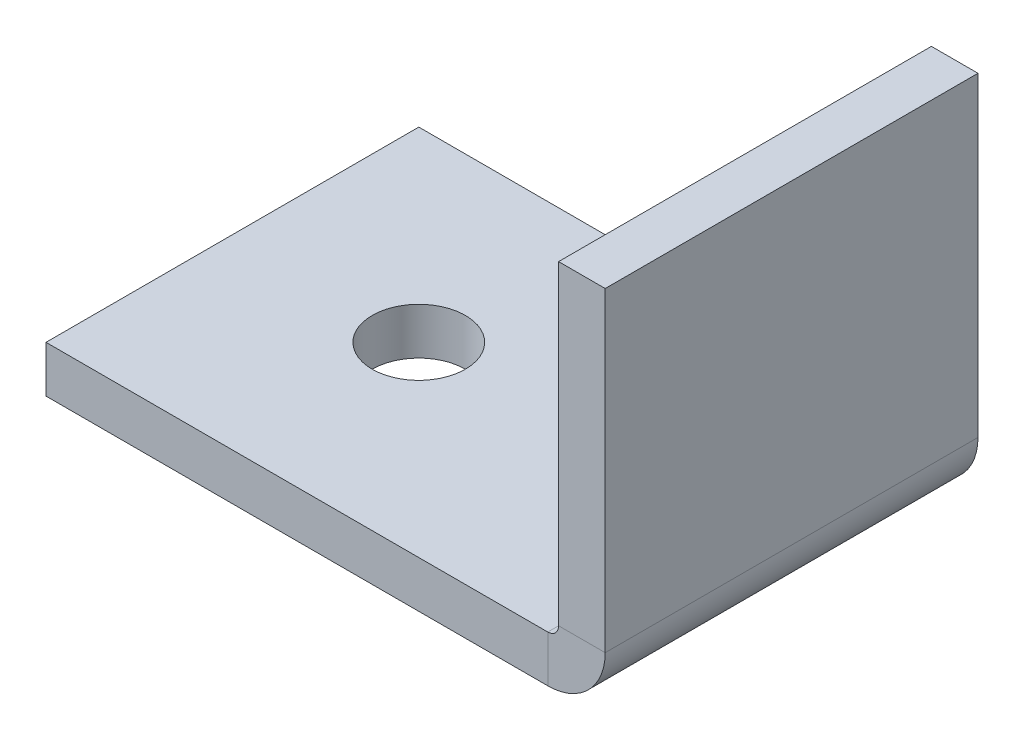
ISO-10303-21;
HEADER;
FILE_DESCRIPTION(('STEP AP214'),'2;1');
FILE_NAME('part.step','',(''),(''),'','','');
FILE_SCHEMA(('AUTOMOTIVE_DESIGN { 1 0 10303 214 1 1 1 1 }'));
ENDSEC;
DATA;
#1=APPLICATION_CONTEXT('core data for automotive mechanical design processes');
#2=APPLICATION_PROTOCOL_DEFINITION('international standard','automotive_design',2000,#1);
#3=PRODUCT_CONTEXT('',#1,'mechanical');
#4=PRODUCT('Part','Part','',(#3));
#5=PRODUCT_RELATED_PRODUCT_CATEGORY('part','',(#4));
#6=PRODUCT_DEFINITION_FORMATION('','',#4);
#7=PRODUCT_DEFINITION_CONTEXT('part definition',#1,'design');
#8=PRODUCT_DEFINITION('design','',#6,#7);
#9=PRODUCT_DEFINITION_SHAPE('','',#8);
#10=(LENGTH_UNIT() NAMED_UNIT(*) SI_UNIT(.MILLI.,.METRE.));
#11=(NAMED_UNIT(*) PLANE_ANGLE_UNIT() SI_UNIT($,.RADIAN.));
#12=(NAMED_UNIT(*) SI_UNIT($,.STERADIAN.) SOLID_ANGLE_UNIT());
#13=UNCERTAINTY_MEASURE_WITH_UNIT(LENGTH_MEASURE(1.E-05),#10,'distance_accuracy_value','');
#14=(GEOMETRIC_REPRESENTATION_CONTEXT(3) GLOBAL_UNCERTAINTY_ASSIGNED_CONTEXT((#13)) GLOBAL_UNIT_ASSIGNED_CONTEXT((#10,
#11,#12)) REPRESENTATION_CONTEXT('',''));
#15=CARTESIAN_POINT('',(0.,0.,0.));
#16=DIRECTION('',(0.,0.,1.));
#17=DIRECTION('',(1.,0.,0.));
#18=AXIS2_PLACEMENT_3D('',#15,#16,#17);
#19=CARTESIAN_POINT('',(-19.05,-3.175,-12.7));
#20=DIRECTION('',(0.,0.,-1.));
#21=DIRECTION('',(-1.,0.,0.));
#22=AXIS2_PLACEMENT_3D('',#19,#20,#21);
#23=PLANE('',#22);
#24=DIRECTION('',(-1.,0.,0.));
#25=VECTOR('',#24,1.);
#26=CARTESIAN_POINT('',(-19.05,0.,-12.7));
#27=LINE('',#26,#25);
#28=CARTESIAN_POINT('',(15.1384,0.,-12.7));
#29=VERTEX_POINT('',#28);
#30=CARTESIAN_POINT('',(-19.05,0.,-12.7));
#31=VERTEX_POINT('',#30);
#32=EDGE_CURVE('E113',#29,#31,#27,.T.);
#33=ORIENTED_EDGE('',*,*,#32,.F.);
#34=DIRECTION('',(0.,-1.,0.));
#35=VECTOR('',#34,1.);
#36=CARTESIAN_POINT('',(15.1384,0.,-12.7));
#37=LINE('',#36,#35);
#38=CARTESIAN_POINT('',(15.1384,-3.175,-12.7));
#39=VERTEX_POINT('',#38);
#40=EDGE_CURVE('E126',#29,#39,#37,.T.);
#41=ORIENTED_EDGE('',*,*,#40,.T.);
#42=DIRECTION('',(-1.,0.,0.));
#43=VECTOR('',#42,1.);
#44=CARTESIAN_POINT('',(-19.05,-3.175,-12.7));
#45=LINE('',#44,#43);
#46=CARTESIAN_POINT('',(-19.05,-3.175,-12.7));
#47=VERTEX_POINT('',#46);
#48=EDGE_CURVE('E118',#39,#47,#45,.T.);
#49=ORIENTED_EDGE('',*,*,#48,.T.);
#50=DIRECTION('',(0.,1.,0.));
#51=VECTOR('',#50,1.);
#52=CARTESIAN_POINT('',(-19.05,-3.175,-12.7));
#53=LINE('',#52,#51);
#54=EDGE_CURVE('E68',#47,#31,#53,.T.);
#55=ORIENTED_EDGE('',*,*,#54,.T.);
#56=EDGE_LOOP('',(#33,#41,#49,#55));
#57=FACE_BOUND('',#56,.T.);
#58=ADVANCED_FACE('F65',(#57),#23,.T.);
#59=CARTESIAN_POINT('',(0.,-3.175,0.));
#60=DIRECTION('',(0.,-1.,0.));
#61=DIRECTION('',(0.,0.,-1.));
#62=AXIS2_PLACEMENT_3D('',#59,#60,#61);
#63=PLANE('',#62);
#64=CARTESIAN_POINT('',(-6.34999999999992,-3.175,0.));
#65=DIRECTION('',(0.,1.,0.));
#66=DIRECTION('',(0.,0.,1.));
#67=AXIS2_PLACEMENT_3D('',#64,#65,#66);
#68=CIRCLE('',#67,3.175);
#69=CARTESIAN_POINT('',(-6.34999999999992,-3.175,3.175));
#70=VERTEX_POINT('',#69);
#71=EDGE_CURVE('E151',#70,#70,#68,.T.);
#72=ORIENTED_EDGE('',*,*,#71,.T.);
#73=EDGE_LOOP('',(#72));
#74=FACE_BOUND('',#73,.T.);
#75=ORIENTED_EDGE('',*,*,#48,.F.);
#76=DIRECTION('',(0.,0.,-1.));
#77=VECTOR('',#76,1.);
#78=CARTESIAN_POINT('',(15.1384,-3.175,-12.7));
#79=LINE('',#78,#77);
#80=CARTESIAN_POINT('',(15.1384,-3.175,12.7));
#81=VERTEX_POINT('',#80);
#82=EDGE_CURVE('E143',#39,#81,#79,.F.);
#83=ORIENTED_EDGE('',*,*,#82,.T.);
#84=DIRECTION('',(1.,0.,0.));
#85=VECTOR('',#84,1.);
#86=CARTESIAN_POINT('',(-19.05,-3.175,12.7));
#87=LINE('',#86,#85);
#88=CARTESIAN_POINT('',(-19.05,-3.175,12.7));
#89=VERTEX_POINT('',#88);
#90=EDGE_CURVE('E123',#89,#81,#87,.T.);
#91=ORIENTED_EDGE('',*,*,#90,.F.);
#92=DIRECTION('',(0.,0.,1.));
#93=VECTOR('',#92,1.);
#94=CARTESIAN_POINT('',(-19.05,-3.175,12.7));
#95=LINE('',#94,#93);
#96=EDGE_CURVE('E103',#47,#89,#95,.T.);
#97=ORIENTED_EDGE('',*,*,#96,.F.);
#98=EDGE_LOOP('',(#75,#83,#91,#97));
#99=FACE_BOUND('',#98,.T.);
#100=ADVANCED_FACE('F188',(#74,#99),#63,.T.);
#101=CARTESIAN_POINT('',(0.,0.,0.));
#102=DIRECTION('',(0.,-1.,0.));
#103=DIRECTION('',(0.,0.,-1.));
#104=AXIS2_PLACEMENT_3D('',#101,#102,#103);
#105=PLANE('',#104);
#106=CARTESIAN_POINT('',(-6.34999999999992,0.,0.));
#107=DIRECTION('',(0.,1.,0.));
#108=DIRECTION('',(0.,0.,1.));
#109=AXIS2_PLACEMENT_3D('',#106,#107,#108);
#110=CIRCLE('',#109,3.175);
#111=CARTESIAN_POINT('',(-6.34999999999992,0.,3.175));
#112=VERTEX_POINT('',#111);
#113=EDGE_CURVE('E182',#112,#112,#110,.T.);
#114=ORIENTED_EDGE('',*,*,#113,.F.);
#115=EDGE_LOOP('',(#114));
#116=FACE_BOUND('',#115,.T.);
#117=DIRECTION('',(0.,0.,-1.));
#118=VECTOR('',#117,1.);
#119=CARTESIAN_POINT('',(15.1384,0.,-12.7));
#120=LINE('',#119,#118);
#121=CARTESIAN_POINT('',(15.1384,0.,12.7));
#122=VERTEX_POINT('',#121);
#123=EDGE_CURVE('E133',#29,#122,#120,.F.);
#124=ORIENTED_EDGE('',*,*,#123,.F.);
#125=ORIENTED_EDGE('',*,*,#32,.T.);
#126=DIRECTION('',(0.,0.,1.));
#127=VECTOR('',#126,1.);
#128=CARTESIAN_POINT('',(-19.05,0.,12.7));
#129=LINE('',#128,#127);
#130=CARTESIAN_POINT('',(-19.05,0.,12.7));
#131=VERTEX_POINT('',#130);
#132=EDGE_CURVE('E101',#31,#131,#129,.T.);
#133=ORIENTED_EDGE('',*,*,#132,.T.);
#134=DIRECTION('',(1.,0.,0.));
#135=VECTOR('',#134,1.);
#136=CARTESIAN_POINT('',(-19.05,0.,12.7));
#137=LINE('',#136,#135);
#138=EDGE_CURVE('E110',#131,#122,#137,.T.);
#139=ORIENTED_EDGE('',*,*,#138,.T.);
#140=EDGE_LOOP('',(#124,#125,#133,#139));
#141=FACE_BOUND('',#140,.T.);
#142=ADVANCED_FACE('F108',(#116,#141),#105,.F.);
#143=CARTESIAN_POINT('',(-19.05,-3.175,12.7));
#144=DIRECTION('',(0.,0.,1.));
#145=DIRECTION('',(1.,0.,0.));
#146=AXIS2_PLACEMENT_3D('',#143,#144,#145);
#147=PLANE('',#146);
#148=DIRECTION('',(0.,-1.,0.));
#149=VECTOR('',#148,1.);
#150=CARTESIAN_POINT('',(15.1384,0.,12.7));
#151=LINE('',#150,#149);
#152=EDGE_CURVE('E117',#122,#81,#151,.T.);
#153=ORIENTED_EDGE('',*,*,#152,.F.);
#154=ORIENTED_EDGE('',*,*,#138,.F.);
#155=DIRECTION('',(0.,1.,0.));
#156=VECTOR('',#155,1.);
#157=CARTESIAN_POINT('',(-19.05,-3.175,12.7));
#158=LINE('',#157,#156);
#159=EDGE_CURVE('E13',#89,#131,#158,.T.);
#160=ORIENTED_EDGE('',*,*,#159,.F.);
#161=ORIENTED_EDGE('',*,*,#90,.T.);
#162=EDGE_LOOP('',(#153,#154,#160,#161));
#163=FACE_BOUND('',#162,.T.);
#164=ADVANCED_FACE('F116',(#163),#147,.T.);
#165=CARTESIAN_POINT('',(-19.05,-3.175,12.7));
#166=DIRECTION('',(-1.,0.,0.));
#167=DIRECTION('',(0.,0.,1.));
#168=AXIS2_PLACEMENT_3D('',#165,#166,#167);
#169=PLANE('',#168);
#170=ORIENTED_EDGE('',*,*,#132,.F.);
#171=ORIENTED_EDGE('',*,*,#54,.F.);
#172=ORIENTED_EDGE('',*,*,#96,.T.);
#173=ORIENTED_EDGE('',*,*,#159,.T.);
#174=EDGE_LOOP('',(#170,#171,#172,#173));
#175=FACE_BOUND('',#174,.T.);
#176=ADVANCED_FACE('F99',(#175),#169,.T.);
#177=CARTESIAN_POINT('',(15.1384,0.736599999999999,12.7));
#178=DIRECTION('',(0.,0.,1.));
#179=DIRECTION('',(1.,0.,0.));
#180=AXIS2_PLACEMENT_3D('',#177,#178,#179);
#181=PLANE('',#180);
#182=DIRECTION('',(-1.,0.,0.));
#183=VECTOR('',#182,1.);
#184=CARTESIAN_POINT('',(19.05,0.736599999999986,12.7));
#185=LINE('',#184,#183);
#186=CARTESIAN_POINT('',(15.875,0.736599999999997,12.7));
#187=VERTEX_POINT('',#186);
#188=CARTESIAN_POINT('',(19.05,0.736599999999986,12.7));
#189=VERTEX_POINT('',#188);
#190=EDGE_CURVE('E147',#187,#189,#185,.F.);
#191=ORIENTED_EDGE('',*,*,#190,.F.);
#192=CARTESIAN_POINT('',(15.1384,0.736599999999999,12.7));
#193=DIRECTION('',(0.,0.,-1.));
#194=DIRECTION('',(-1.,0.,0.));
#195=AXIS2_PLACEMENT_3D('',#192,#193,#194);
#196=CIRCLE('',#195,0.7366);
#197=EDGE_CURVE('E137',#122,#187,#196,.F.);
#198=ORIENTED_EDGE('',*,*,#197,.F.);
#199=ORIENTED_EDGE('',*,*,#152,.T.);
#200=CARTESIAN_POINT('',(15.1384,0.736599999999999,12.7));
#201=DIRECTION('',(0.,0.,-1.));
#202=DIRECTION('',(-1.,0.,0.));
#203=AXIS2_PLACEMENT_3D('',#200,#201,#202);
#204=CIRCLE('',#203,3.9116);
#205=EDGE_CURVE('E79',#81,#189,#204,.F.);
#206=ORIENTED_EDGE('',*,*,#205,.T.);
#207=EDGE_LOOP('',(#191,#198,#199,#206));
#208=FACE_BOUND('',#207,.T.);
#209=ADVANCED_FACE('F262',(#208),#181,.T.);
#210=CARTESIAN_POINT('',(15.1384,0.736599999999999,-12.7));
#211=DIRECTION('',(0.,0.,1.));
#212=DIRECTION('',(1.,0.,0.));
#213=AXIS2_PLACEMENT_3D('',#210,#211,#212);
#214=PLANE('',#213);
#215=CARTESIAN_POINT('',(15.1384,0.736599999999999,-12.7));
#216=DIRECTION('',(0.,0.,-1.));
#217=DIRECTION('',(-1.,0.,0.));
#218=AXIS2_PLACEMENT_3D('',#215,#216,#217);
#219=CIRCLE('',#218,0.7366);
#220=CARTESIAN_POINT('',(15.875,0.736599999999997,-12.7));
#221=VERTEX_POINT('',#220);
#222=EDGE_CURVE('E130',#221,#29,#219,.T.);
#223=ORIENTED_EDGE('',*,*,#222,.F.);
#224=DIRECTION('',(-1.,0.,0.));
#225=VECTOR('',#224,1.);
#226=CARTESIAN_POINT('',(15.875,0.736599999999997,-12.7));
#227=LINE('',#226,#225);
#228=CARTESIAN_POINT('',(19.05,0.736599999999986,-12.7));
#229=VERTEX_POINT('',#228);
#230=EDGE_CURVE('E154',#221,#229,#227,.F.);
#231=ORIENTED_EDGE('',*,*,#230,.T.);
#232=CARTESIAN_POINT('',(15.1384,0.736599999999999,-12.7));
#233=DIRECTION('',(0.,0.,-1.));
#234=DIRECTION('',(-1.,0.,0.));
#235=AXIS2_PLACEMENT_3D('',#232,#233,#234);
#236=CIRCLE('',#235,3.9116);
#237=EDGE_CURVE('E140',#229,#39,#236,.T.);
#238=ORIENTED_EDGE('',*,*,#237,.T.);
#239=ORIENTED_EDGE('',*,*,#40,.F.);
#240=EDGE_LOOP('',(#223,#231,#238,#239));
#241=FACE_BOUND('',#240,.T.);
#242=ADVANCED_FACE('F242',(#241),#214,.F.);
#243=CARTESIAN_POINT('',(15.1384,0.736599999999999,-12.7));
#244=DIRECTION('',(0.,0.,-1.));
#245=DIRECTION('',(1.,0.,0.));
#246=AXIS2_PLACEMENT_3D('',#243,#244,#245);
#247=CYLINDRICAL_SURFACE('',#246,3.9116);
#248=ORIENTED_EDGE('',*,*,#82,.F.);
#249=ORIENTED_EDGE('',*,*,#237,.F.);
#250=DIRECTION('',(0.,0.,-1.));
#251=VECTOR('',#250,1.);
#252=CARTESIAN_POINT('',(19.05,0.736599999999986,12.7));
#253=LINE('',#252,#251);
#254=EDGE_CURVE('E157',#229,#189,#253,.F.);
#255=ORIENTED_EDGE('',*,*,#254,.T.);
#256=ORIENTED_EDGE('',*,*,#205,.F.);
#257=EDGE_LOOP('',(#248,#249,#255,#256));
#258=FACE_BOUND('',#257,.T.);
#259=ADVANCED_FACE('F241',(#258),#247,.T.);
#260=CARTESIAN_POINT('',(15.1384,0.736599999999999,-12.7));
#261=DIRECTION('',(0.,0.,-1.));
#262=DIRECTION('',(1.,0.,0.));
#263=AXIS2_PLACEMENT_3D('',#260,#261,#262);
#264=CYLINDRICAL_SURFACE('',#263,0.7366);
#265=ORIENTED_EDGE('',*,*,#123,.T.);
#266=ORIENTED_EDGE('',*,*,#197,.T.);
#267=DIRECTION('',(0.,0.,-1.));
#268=VECTOR('',#267,1.);
#269=CARTESIAN_POINT('',(15.875,0.736599999999997,12.7));
#270=LINE('',#269,#268);
#271=EDGE_CURVE('E150',#187,#221,#270,.T.);
#272=ORIENTED_EDGE('',*,*,#271,.T.);
#273=ORIENTED_EDGE('',*,*,#222,.T.);
#274=EDGE_LOOP('',(#265,#266,#272,#273));
#275=FACE_BOUND('',#274,.T.);
#276=ADVANCED_FACE('F261',(#275),#264,.F.);
#277=CARTESIAN_POINT('',(19.0500000000001,22.225,-12.7));
#278=DIRECTION('',(0.,0.,1.));
#279=DIRECTION('',(1.,0.,0.));
#280=AXIS2_PLACEMENT_3D('',#277,#278,#279);
#281=PLANE('',#280);
#282=ORIENTED_EDGE('',*,*,#230,.F.);
#283=DIRECTION('',(0.,-1.,0.));
#284=VECTOR('',#283,1.);
#285=CARTESIAN_POINT('',(15.8750000000001,22.225,-12.7));
#286=LINE('',#285,#284);
#287=CARTESIAN_POINT('',(15.8750000000001,22.225,-12.7));
#288=VERTEX_POINT('',#287);
#289=EDGE_CURVE('E159',#221,#288,#286,.F.);
#290=ORIENTED_EDGE('',*,*,#289,.T.);
#291=DIRECTION('',(-1.,0.,0.));
#292=VECTOR('',#291,1.);
#293=CARTESIAN_POINT('',(19.0500000000001,22.225,-12.7));
#294=LINE('',#293,#292);
#295=CARTESIAN_POINT('',(19.0500000000001,22.225,-12.7));
#296=VERTEX_POINT('',#295);
#297=EDGE_CURVE('E134',#296,#288,#294,.T.);
#298=ORIENTED_EDGE('',*,*,#297,.F.);
#299=DIRECTION('',(0.,1.,0.));
#300=VECTOR('',#299,1.);
#301=CARTESIAN_POINT('',(19.05,0.,-12.7));
#302=LINE('',#301,#300);
#303=EDGE_CURVE('E168',#229,#296,#302,.T.);
#304=ORIENTED_EDGE('',*,*,#303,.F.);
#305=EDGE_LOOP('',(#282,#290,#298,#304));
#306=FACE_BOUND('',#305,.T.);
#307=ADVANCED_FACE('F251',(#306),#281,.F.);
#308=CARTESIAN_POINT('',(19.05,0.,12.7));
#309=DIRECTION('',(0.,0.,-1.));
#310=DIRECTION('',(-1.,0.,0.));
#311=AXIS2_PLACEMENT_3D('',#308,#309,#310);
#312=PLANE('',#311);
#313=ORIENTED_EDGE('',*,*,#190,.T.);
#314=DIRECTION('',(0.,-1.,0.));
#315=VECTOR('',#314,1.);
#316=CARTESIAN_POINT('',(19.05,0.,12.7));
#317=LINE('',#316,#315);
#318=CARTESIAN_POINT('',(19.0500000000001,22.225,12.7));
#319=VERTEX_POINT('',#318);
#320=EDGE_CURVE('E174',#319,#189,#317,.T.);
#321=ORIENTED_EDGE('',*,*,#320,.F.);
#322=DIRECTION('',(-1.,0.,0.));
#323=VECTOR('',#322,1.);
#324=CARTESIAN_POINT('',(19.0500000000001,22.225,12.7));
#325=LINE('',#324,#323);
#326=CARTESIAN_POINT('',(15.8750000000001,22.225,12.7));
#327=VERTEX_POINT('',#326);
#328=EDGE_CURVE('E177',#319,#327,#325,.T.);
#329=ORIENTED_EDGE('',*,*,#328,.T.);
#330=DIRECTION('',(0.,1.,0.));
#331=VECTOR('',#330,1.);
#332=CARTESIAN_POINT('',(15.875,0.,12.7));
#333=LINE('',#332,#331);
#334=EDGE_CURVE('E165',#327,#187,#333,.F.);
#335=ORIENTED_EDGE('',*,*,#334,.T.);
#336=EDGE_LOOP('',(#313,#321,#329,#335));
#337=FACE_BOUND('',#336,.T.);
#338=ADVANCED_FACE('F256',(#337),#312,.F.);
#339=CARTESIAN_POINT('',(19.05,0.,0.));
#340=DIRECTION('',(-1.,0.,0.));
#341=DIRECTION('',(0.,-1.,0.));
#342=AXIS2_PLACEMENT_3D('',#339,#340,#341);
#343=PLANE('',#342);
#344=ORIENTED_EDGE('',*,*,#254,.F.);
#345=ORIENTED_EDGE('',*,*,#303,.T.);
#346=DIRECTION('',(0.,0.,1.));
#347=VECTOR('',#346,1.);
#348=CARTESIAN_POINT('',(19.0500000000001,22.225,0.));
#349=LINE('',#348,#347);
#350=EDGE_CURVE('E171',#296,#319,#349,.T.);
#351=ORIENTED_EDGE('',*,*,#350,.T.);
#352=ORIENTED_EDGE('',*,*,#320,.T.);
#353=EDGE_LOOP('',(#344,#345,#351,#352));
#354=FACE_BOUND('',#353,.T.);
#355=ADVANCED_FACE('F248',(#354),#343,.F.);
#356=CARTESIAN_POINT('',(15.875,0.,0.));
#357=DIRECTION('',(-1.,0.,0.));
#358=DIRECTION('',(0.,-1.,0.));
#359=AXIS2_PLACEMENT_3D('',#356,#357,#358);
#360=PLANE('',#359);
#361=ORIENTED_EDGE('',*,*,#289,.F.);
#362=ORIENTED_EDGE('',*,*,#271,.F.);
#363=ORIENTED_EDGE('',*,*,#334,.F.);
#364=DIRECTION('',(0.,0.,-1.));
#365=VECTOR('',#364,1.);
#366=CARTESIAN_POINT('',(15.8750000000001,22.225,12.7));
#367=LINE('',#366,#365);
#368=EDGE_CURVE('E162',#288,#327,#367,.F.);
#369=ORIENTED_EDGE('',*,*,#368,.F.);
#370=EDGE_LOOP('',(#361,#362,#363,#369));
#371=FACE_BOUND('',#370,.T.);
#372=ADVANCED_FACE('F259',(#371),#360,.T.);
#373=CARTESIAN_POINT('',(19.0500000000001,22.225,12.7));
#374=DIRECTION('',(0.,-1.,0.));
#375=DIRECTION('',(1.,0.,0.));
#376=AXIS2_PLACEMENT_3D('',#373,#374,#375);
#377=PLANE('',#376);
#378=ORIENTED_EDGE('',*,*,#368,.T.);
#379=ORIENTED_EDGE('',*,*,#328,.F.);
#380=ORIENTED_EDGE('',*,*,#350,.F.);
#381=ORIENTED_EDGE('',*,*,#297,.T.);
#382=EDGE_LOOP('',(#378,#379,#380,#381));
#383=FACE_BOUND('',#382,.T.);
#384=ADVANCED_FACE('F194',(#383),#377,.F.);
#385=CARTESIAN_POINT('',(-6.34999999999992,-3.175,0.));
#386=DIRECTION('',(0.,1.,0.));
#387=DIRECTION('',(0.,0.,1.));
#388=AXIS2_PLACEMENT_3D('',#385,#386,#387);
#389=CYLINDRICAL_SURFACE('',#388,3.175);
#390=ORIENTED_EDGE('',*,*,#71,.F.);
#391=EDGE_LOOP('',(#390));
#392=FACE_BOUND('',#391,.T.);
#393=ORIENTED_EDGE('',*,*,#113,.T.);
#394=EDGE_LOOP('',(#393));
#395=FACE_BOUND('',#394,.T.);
#396=ADVANCED_FACE('F191',(#392,#395),#389,.F.);
#397=CLOSED_SHELL('',(#58,#100,#142,#164,#176,#209,#242,#259,#276,#307,#338,#355,#372,#384,#396));
#398=MANIFOLD_SOLID_BREP('B2',#397);
#399=ADVANCED_BREP_SHAPE_REPRESENTATION('',(#18,#398),#14);
#400=SHAPE_DEFINITION_REPRESENTATION(#9,#399);
ENDSEC;
END-ISO-10303-21;
